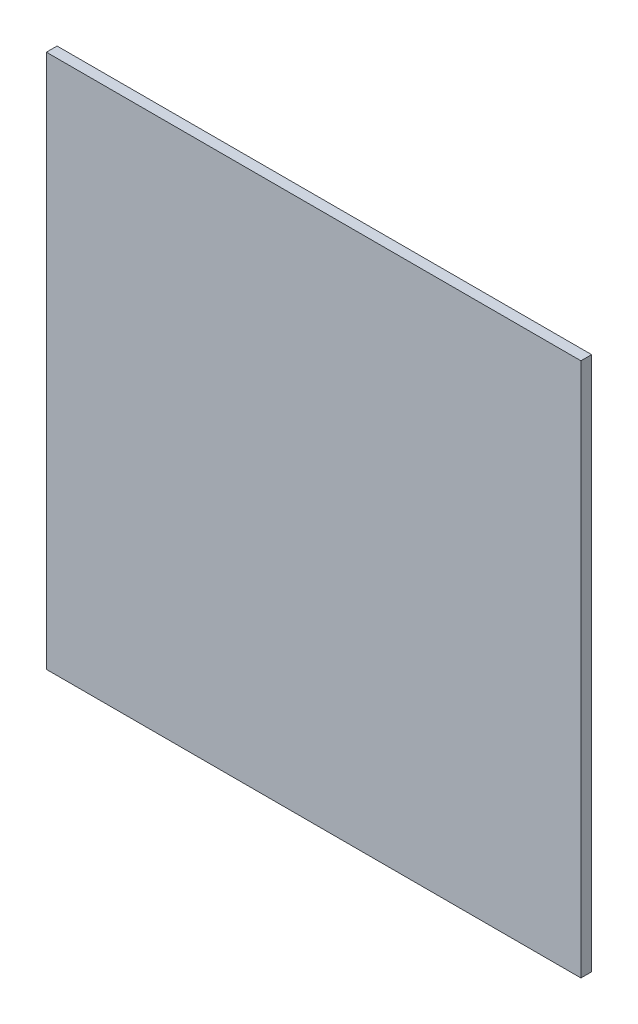
ISO-10303-21;
HEADER;
FILE_DESCRIPTION(('STEP AP214'),'2;1');
FILE_NAME('part.step','',(''),(''),'','','');
FILE_SCHEMA(('AUTOMOTIVE_DESIGN { 1 0 10303 214 1 1 1 1 }'));
ENDSEC;
DATA;
#1=APPLICATION_CONTEXT('core data for automotive mechanical design processes');
#2=APPLICATION_PROTOCOL_DEFINITION('international standard','automotive_design',2000,#1);
#3=PRODUCT_CONTEXT('',#1,'mechanical');
#4=PRODUCT('Part','Part','',(#3));
#5=PRODUCT_RELATED_PRODUCT_CATEGORY('part','',(#4));
#6=PRODUCT_DEFINITION_FORMATION('','',#4);
#7=PRODUCT_DEFINITION_CONTEXT('part definition',#1,'design');
#8=PRODUCT_DEFINITION('design','',#6,#7);
#9=PRODUCT_DEFINITION_SHAPE('','',#8);
#10=(LENGTH_UNIT() NAMED_UNIT(*) SI_UNIT(.MILLI.,.METRE.));
#11=(NAMED_UNIT(*) PLANE_ANGLE_UNIT() SI_UNIT($,.RADIAN.));
#12=(NAMED_UNIT(*) SI_UNIT($,.STERADIAN.) SOLID_ANGLE_UNIT());
#13=UNCERTAINTY_MEASURE_WITH_UNIT(LENGTH_MEASURE(1.E-05),#10,'distance_accuracy_value','');
#14=(GEOMETRIC_REPRESENTATION_CONTEXT(3) GLOBAL_UNCERTAINTY_ASSIGNED_CONTEXT((#13)) GLOBAL_UNIT_ASSIGNED_CONTEXT((#10,
#11,#12)) REPRESENTATION_CONTEXT('',''));
#15=CARTESIAN_POINT('',(0.,0.,0.));
#16=DIRECTION('',(0.,0.,1.));
#17=DIRECTION('',(1.,0.,0.));
#18=AXIS2_PLACEMENT_3D('',#15,#16,#17);
#19=CARTESIAN_POINT('',(-9.525,9.525,0.381));
#20=DIRECTION('',(1.,0.,0.));
#21=DIRECTION('',(0.,1.,0.));
#22=AXIS2_PLACEMENT_3D('',#19,#20,#21);
#23=PLANE('',#22);
#24=DIRECTION('',(0.,-1.,0.));
#25=VECTOR('',#24,1.);
#26=CARTESIAN_POINT('',(-9.525,9.525,0.));
#27=LINE('',#26,#25);
#28=CARTESIAN_POINT('',(-9.525,9.525,0.));
#29=VERTEX_POINT('',#28);
#30=CARTESIAN_POINT('',(-9.525,-9.525,0.));
#31=VERTEX_POINT('',#30);
#32=EDGE_CURVE('E118',#29,#31,#27,.T.);
#33=ORIENTED_EDGE('',*,*,#32,.T.);
#34=DIRECTION('',(0.,0.,-1.));
#35=VECTOR('',#34,1.);
#36=CARTESIAN_POINT('',(-9.525,-9.525,0.381));
#37=LINE('',#36,#35);
#38=CARTESIAN_POINT('',(-9.525,-9.525,0.381));
#39=VERTEX_POINT('',#38);
#40=EDGE_CURVE('E11',#39,#31,#37,.T.);
#41=ORIENTED_EDGE('',*,*,#40,.F.);
#42=DIRECTION('',(0.,-1.,0.));
#43=VECTOR('',#42,1.);
#44=CARTESIAN_POINT('',(-9.525,9.525,0.381));
#45=LINE('',#44,#43);
#46=CARTESIAN_POINT('',(-9.525,9.525,0.381));
#47=VERTEX_POINT('',#46);
#48=EDGE_CURVE('E99',#47,#39,#45,.T.);
#49=ORIENTED_EDGE('',*,*,#48,.F.);
#50=DIRECTION('',(0.,0.,-1.));
#51=VECTOR('',#50,1.);
#52=CARTESIAN_POINT('',(-9.525,9.525,0.381));
#53=LINE('',#52,#51);
#54=EDGE_CURVE('E114',#47,#29,#53,.T.);
#55=ORIENTED_EDGE('',*,*,#54,.T.);
#56=EDGE_LOOP('',(#33,#41,#49,#55));
#57=FACE_BOUND('',#56,.T.);
#58=ADVANCED_FACE('F47',(#57),#23,.F.);
#59=CARTESIAN_POINT('',(9.525,-9.525,0.381));
#60=DIRECTION('',(0.,1.,0.));
#61=DIRECTION('',(-1.,0.,0.));
#62=AXIS2_PLACEMENT_3D('',#59,#60,#61);
#63=PLANE('',#62);
#64=DIRECTION('',(1.,0.,0.));
#65=VECTOR('',#64,1.);
#66=CARTESIAN_POINT('',(9.525,-9.525,0.));
#67=LINE('',#66,#65);
#68=CARTESIAN_POINT('',(9.525,-9.525,0.));
#69=VERTEX_POINT('',#68);
#70=EDGE_CURVE('E104',#31,#69,#67,.T.);
#71=ORIENTED_EDGE('',*,*,#70,.T.);
#72=DIRECTION('',(0.,0.,-1.));
#73=VECTOR('',#72,1.);
#74=CARTESIAN_POINT('',(9.525,-9.525,0.381));
#75=LINE('',#74,#73);
#76=CARTESIAN_POINT('',(9.525,-9.525,0.381));
#77=VERTEX_POINT('',#76);
#78=EDGE_CURVE('E56',#77,#69,#75,.T.);
#79=ORIENTED_EDGE('',*,*,#78,.F.);
#80=DIRECTION('',(1.,0.,0.));
#81=VECTOR('',#80,1.);
#82=CARTESIAN_POINT('',(9.525,-9.525,0.381));
#83=LINE('',#82,#81);
#84=EDGE_CURVE('E94',#39,#77,#83,.T.);
#85=ORIENTED_EDGE('',*,*,#84,.F.);
#86=ORIENTED_EDGE('',*,*,#40,.T.);
#87=EDGE_LOOP('',(#71,#79,#85,#86));
#88=FACE_BOUND('',#87,.T.);
#89=ADVANCED_FACE('F103',(#88),#63,.F.);
#90=CARTESIAN_POINT('',(9.525,9.525,0.381));
#91=DIRECTION('',(-1.,0.,0.));
#92=DIRECTION('',(0.,0.,1.));
#93=AXIS2_PLACEMENT_3D('',#90,#91,#92);
#94=PLANE('',#93);
#95=DIRECTION('',(0.,1.,0.));
#96=VECTOR('',#95,1.);
#97=CARTESIAN_POINT('',(9.525,9.525,0.));
#98=LINE('',#97,#96);
#99=CARTESIAN_POINT('',(9.525,9.525,0.));
#100=VERTEX_POINT('',#99);
#101=EDGE_CURVE('E81',#69,#100,#98,.T.);
#102=ORIENTED_EDGE('',*,*,#101,.T.);
#103=DIRECTION('',(0.,0.,-1.));
#104=VECTOR('',#103,1.);
#105=CARTESIAN_POINT('',(9.525,9.525,0.381));
#106=LINE('',#105,#104);
#107=CARTESIAN_POINT('',(9.525,9.525,0.381));
#108=VERTEX_POINT('',#107);
#109=EDGE_CURVE('E106',#108,#100,#106,.T.);
#110=ORIENTED_EDGE('',*,*,#109,.F.);
#111=DIRECTION('',(0.,1.,0.));
#112=VECTOR('',#111,1.);
#113=CARTESIAN_POINT('',(9.525,9.525,0.381));
#114=LINE('',#113,#112);
#115=EDGE_CURVE('E97',#77,#108,#114,.T.);
#116=ORIENTED_EDGE('',*,*,#115,.F.);
#117=ORIENTED_EDGE('',*,*,#78,.T.);
#118=EDGE_LOOP('',(#102,#110,#116,#117));
#119=FACE_BOUND('',#118,.T.);
#120=ADVANCED_FACE('F107',(#119),#94,.F.);
#121=CARTESIAN_POINT('',(9.525,9.525,0.381));
#122=DIRECTION('',(0.,-1.,0.));
#123=DIRECTION('',(1.,0.,0.));
#124=AXIS2_PLACEMENT_3D('',#121,#122,#123);
#125=PLANE('',#124);
#126=DIRECTION('',(-1.,0.,0.));
#127=VECTOR('',#126,1.);
#128=CARTESIAN_POINT('',(9.525,9.525,0.));
#129=LINE('',#128,#127);
#130=EDGE_CURVE('E87',#100,#29,#129,.T.);
#131=ORIENTED_EDGE('',*,*,#130,.T.);
#132=ORIENTED_EDGE('',*,*,#54,.F.);
#133=DIRECTION('',(-1.,0.,0.));
#134=VECTOR('',#133,1.);
#135=CARTESIAN_POINT('',(9.525,9.525,0.381));
#136=LINE('',#135,#134);
#137=EDGE_CURVE('E64',#108,#47,#136,.T.);
#138=ORIENTED_EDGE('',*,*,#137,.F.);
#139=ORIENTED_EDGE('',*,*,#109,.T.);
#140=EDGE_LOOP('',(#131,#132,#138,#139));
#141=FACE_BOUND('',#140,.T.);
#142=ADVANCED_FACE('F130',(#141),#125,.F.);
#143=CARTESIAN_POINT('',(0.,0.,0.381));
#144=DIRECTION('',(0.,0.,-1.));
#145=DIRECTION('',(-1.,0.,0.));
#146=AXIS2_PLACEMENT_3D('',#143,#144,#145);
#147=PLANE('',#146);
#148=ORIENTED_EDGE('',*,*,#48,.T.);
#149=ORIENTED_EDGE('',*,*,#84,.T.);
#150=ORIENTED_EDGE('',*,*,#115,.T.);
#151=ORIENTED_EDGE('',*,*,#137,.T.);
#152=EDGE_LOOP('',(#148,#149,#150,#151));
#153=FACE_BOUND('',#152,.T.);
#154=ADVANCED_FACE('F95',(#153),#147,.F.);
#155=CARTESIAN_POINT('',(0.,0.,0.));
#156=DIRECTION('',(0.,0.,-1.));
#157=DIRECTION('',(-1.,0.,0.));
#158=AXIS2_PLACEMENT_3D('',#155,#156,#157);
#159=PLANE('',#158);
#160=ORIENTED_EDGE('',*,*,#32,.F.);
#161=ORIENTED_EDGE('',*,*,#130,.F.);
#162=ORIENTED_EDGE('',*,*,#101,.F.);
#163=ORIENTED_EDGE('',*,*,#70,.F.);
#164=EDGE_LOOP('',(#160,#161,#162,#163));
#165=FACE_BOUND('',#164,.T.);
#166=ADVANCED_FACE('F133',(#165),#159,.T.);
#167=CLOSED_SHELL('',(#58,#89,#120,#142,#154,#166));
#168=MANIFOLD_SOLID_BREP('B2',#167);
#169=ADVANCED_BREP_SHAPE_REPRESENTATION('',(#18,#168),#14);
#170=SHAPE_DEFINITION_REPRESENTATION(#9,#169);
ENDSEC;
END-ISO-10303-21;
